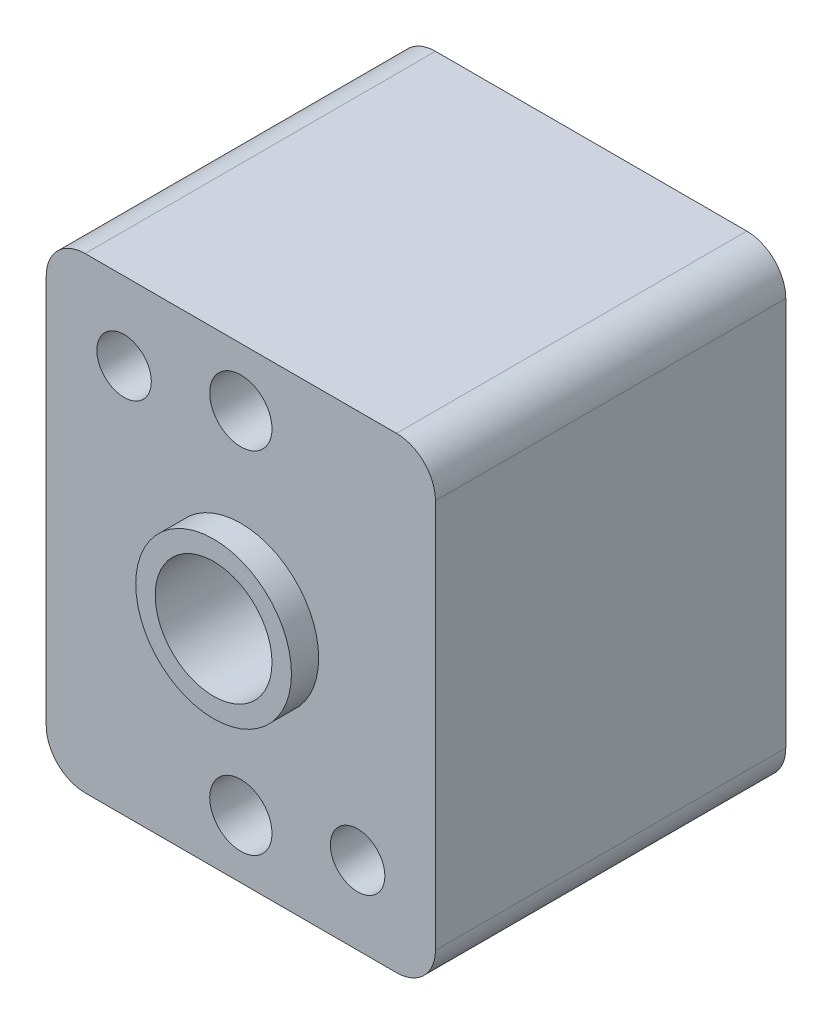
ISO-10303-21;
HEADER;
FILE_DESCRIPTION(('STEP AP214'),'2;1');
FILE_NAME('part.step','',(''),(''),'','','');
FILE_SCHEMA(('AUTOMOTIVE_DESIGN { 1 0 10303 214 1 1 1 1 }'));
ENDSEC;
DATA;
#1=APPLICATION_CONTEXT('core data for automotive mechanical design processes');
#2=APPLICATION_PROTOCOL_DEFINITION('international standard','automotive_design',2000,#1);
#3=PRODUCT_CONTEXT('',#1,'mechanical');
#4=PRODUCT('Part','Part','',(#3));
#5=PRODUCT_RELATED_PRODUCT_CATEGORY('part','',(#4));
#6=PRODUCT_DEFINITION_FORMATION('','',#4);
#7=PRODUCT_DEFINITION_CONTEXT('part definition',#1,'design');
#8=PRODUCT_DEFINITION('design','',#6,#7);
#9=PRODUCT_DEFINITION_SHAPE('','',#8);
#10=(LENGTH_UNIT() NAMED_UNIT(*) SI_UNIT(.MILLI.,.METRE.));
#11=(NAMED_UNIT(*) PLANE_ANGLE_UNIT() SI_UNIT($,.RADIAN.));
#12=(NAMED_UNIT(*) SI_UNIT($,.STERADIAN.) SOLID_ANGLE_UNIT());
#13=UNCERTAINTY_MEASURE_WITH_UNIT(LENGTH_MEASURE(1.E-05),#10,'distance_accuracy_value','');
#14=(GEOMETRIC_REPRESENTATION_CONTEXT(3) GLOBAL_UNCERTAINTY_ASSIGNED_CONTEXT((#13)) GLOBAL_UNIT_ASSIGNED_CONTEXT((#10,
#11,#12)) REPRESENTATION_CONTEXT('',''));
#15=CARTESIAN_POINT('',(0.,0.,0.));
#16=DIRECTION('',(0.,0.,1.));
#17=DIRECTION('',(1.,0.,0.));
#18=AXIS2_PLACEMENT_3D('',#15,#16,#17);
#19=CARTESIAN_POINT('',(0.,0.,9.));
#20=DIRECTION('',(0.,0.,-1.));
#21=DIRECTION('',(-1.,0.,0.));
#22=AXIS2_PLACEMENT_3D('',#19,#20,#21);
#23=PLANE('',#22);
#24=CARTESIAN_POINT('',(2.99999999999998,-4.,9.));
#25=DIRECTION('',(0.,0.,1.));
#26=DIRECTION('',(1.,0.,0.));
#27=AXIS2_PLACEMENT_3D('',#24,#25,#26);
#28=CIRCLE('',#27,0.7);
#29=CARTESIAN_POINT('',(3.69999999999999,-4.,9.));
#30=VERTEX_POINT('',#29);
#31=EDGE_CURVE('E223',#30,#30,#28,.T.);
#32=ORIENTED_EDGE('',*,*,#31,.F.);
#33=EDGE_LOOP('',(#32));
#34=FACE_BOUND('',#33,.T.);
#35=CARTESIAN_POINT('',(-3.,4.,9.));
#36=DIRECTION('',(0.,0.,1.));
#37=DIRECTION('',(1.,0.,0.));
#38=AXIS2_PLACEMENT_3D('',#35,#36,#37);
#39=CIRCLE('',#38,0.7);
#40=CARTESIAN_POINT('',(-2.3,4.,9.));
#41=VERTEX_POINT('',#40);
#42=EDGE_CURVE('E215',#41,#41,#39,.T.);
#43=ORIENTED_EDGE('',*,*,#42,.F.);
#44=EDGE_LOOP('',(#43));
#45=FACE_BOUND('',#44,.T.);
#46=CARTESIAN_POINT('',(0.,-4.5,9.));
#47=DIRECTION('',(0.,0.,1.));
#48=DIRECTION('',(-1.,0.,0.));
#49=AXIS2_PLACEMENT_3D('',#46,#47,#48);
#50=CIRCLE('',#49,0.8);
#51=CARTESIAN_POINT('',(-0.8,-4.5,9.));
#52=VERTEX_POINT('',#51);
#53=EDGE_CURVE('E207',#52,#52,#50,.T.);
#54=ORIENTED_EDGE('',*,*,#53,.F.);
#55=EDGE_LOOP('',(#54));
#56=FACE_BOUND('',#55,.T.);
#57=CARTESIAN_POINT('',(0.,4.5,9.));
#58=DIRECTION('',(0.,0.,1.));
#59=DIRECTION('',(1.,0.,0.));
#60=AXIS2_PLACEMENT_3D('',#57,#58,#59);
#61=CIRCLE('',#60,0.8);
#62=CARTESIAN_POINT('',(0.799999999999999,4.5,9.));
#63=VERTEX_POINT('',#62);
#64=EDGE_CURVE('E202',#63,#63,#61,.T.);
#65=ORIENTED_EDGE('',*,*,#64,.F.);
#66=EDGE_LOOP('',(#65));
#67=FACE_BOUND('',#66,.T.);
#68=DIRECTION('',(0.,1.,0.));
#69=VECTOR('',#68,1.);
#70=CARTESIAN_POINT('',(4.99999999999999,-6.,9.));
#71=LINE('',#70,#69);
#72=CARTESIAN_POINT('',(4.99999999999999,-5.,9.));
#73=VERTEX_POINT('',#72);
#74=CARTESIAN_POINT('',(4.99999999999999,5.,9.));
#75=VERTEX_POINT('',#74);
#76=EDGE_CURVE('E150',#73,#75,#71,.T.);
#77=ORIENTED_EDGE('',*,*,#76,.T.);
#78=CARTESIAN_POINT('',(3.99999999999999,5.,9.));
#79=DIRECTION('',(0.,0.,-1.));
#80=DIRECTION('',(-1.,0.,0.));
#81=AXIS2_PLACEMENT_3D('',#78,#79,#80);
#82=CIRCLE('',#81,1.);
#83=CARTESIAN_POINT('',(3.99999999999999,6.,9.));
#84=VERTEX_POINT('',#83);
#85=EDGE_CURVE('E178',#75,#84,#82,.F.);
#86=ORIENTED_EDGE('',*,*,#85,.T.);
#87=DIRECTION('',(-1.,0.,0.));
#88=VECTOR('',#87,1.);
#89=CARTESIAN_POINT('',(-5.00000000000001,6.,9.));
#90=LINE('',#89,#88);
#91=CARTESIAN_POINT('',(-4.00000000000001,6.,9.));
#92=VERTEX_POINT('',#91);
#93=EDGE_CURVE('E127',#84,#92,#90,.T.);
#94=ORIENTED_EDGE('',*,*,#93,.T.);
#95=CARTESIAN_POINT('',(-4.00000000000001,5.,9.));
#96=DIRECTION('',(0.,0.,-1.));
#97=DIRECTION('',(-1.,0.,0.));
#98=AXIS2_PLACEMENT_3D('',#95,#96,#97);
#99=CIRCLE('',#98,1.);
#100=CARTESIAN_POINT('',(-5.00000000000001,5.,9.));
#101=VERTEX_POINT('',#100);
#102=EDGE_CURVE('E175',#92,#101,#99,.F.);
#103=ORIENTED_EDGE('',*,*,#102,.T.);
#104=DIRECTION('',(0.,-1.,0.));
#105=VECTOR('',#104,1.);
#106=CARTESIAN_POINT('',(-5.00000000000001,-6.,9.));
#107=LINE('',#106,#105);
#108=CARTESIAN_POINT('',(-5.00000000000001,-5.,9.));
#109=VERTEX_POINT('',#108);
#110=EDGE_CURVE('E190',#101,#109,#107,.T.);
#111=ORIENTED_EDGE('',*,*,#110,.T.);
#112=CARTESIAN_POINT('',(-4.00000000000001,-5.,9.));
#113=DIRECTION('',(0.,0.,-1.));
#114=DIRECTION('',(-1.,0.,0.));
#115=AXIS2_PLACEMENT_3D('',#112,#113,#114);
#116=CIRCLE('',#115,1.);
#117=CARTESIAN_POINT('',(-4.00000000000001,-6.,9.));
#118=VERTEX_POINT('',#117);
#119=EDGE_CURVE('E61',#109,#118,#116,.F.);
#120=ORIENTED_EDGE('',*,*,#119,.T.);
#121=DIRECTION('',(1.,0.,0.));
#122=VECTOR('',#121,1.);
#123=CARTESIAN_POINT('',(-5.00000000000001,-6.,9.));
#124=LINE('',#123,#122);
#125=CARTESIAN_POINT('',(3.99999999999999,-6.,9.));
#126=VERTEX_POINT('',#125);
#127=EDGE_CURVE('E155',#118,#126,#124,.T.);
#128=ORIENTED_EDGE('',*,*,#127,.T.);
#129=CARTESIAN_POINT('',(3.99999999999999,-5.,9.));
#130=DIRECTION('',(0.,0.,-1.));
#131=DIRECTION('',(-1.,0.,0.));
#132=AXIS2_PLACEMENT_3D('',#129,#130,#131);
#133=CIRCLE('',#132,1.);
#134=EDGE_CURVE('E170',#126,#73,#133,.F.);
#135=ORIENTED_EDGE('',*,*,#134,.T.);
#136=EDGE_LOOP('',(#77,#86,#94,#103,#111,#120,#128,#135));
#137=FACE_BOUND('',#136,.T.);
#138=CARTESIAN_POINT('',(0.,0.,9.));
#139=DIRECTION('',(0.,0.,-1.));
#140=DIRECTION('',(-1.,0.,0.));
#141=AXIS2_PLACEMENT_3D('',#138,#139,#140);
#142=CIRCLE('',#141,2.);
#143=CARTESIAN_POINT('',(-2.,0.,9.));
#144=VERTEX_POINT('',#143);
#145=EDGE_CURVE('E151',#144,#144,#142,.F.);
#146=ORIENTED_EDGE('',*,*,#145,.F.);
#147=EDGE_LOOP('',(#146));
#148=FACE_BOUND('',#147,.T.);
#149=ADVANCED_FACE('F39',(#34,#45,#56,#67,#137,#148),#23,.F.);
#150=CARTESIAN_POINT('',(0.,0.,0.));
#151=DIRECTION('',(0.,0.,-1.));
#152=DIRECTION('',(-1.,0.,0.));
#153=AXIS2_PLACEMENT_3D('',#150,#151,#152);
#154=PLANE('',#153);
#155=CARTESIAN_POINT('',(-3.,4.,0.));
#156=DIRECTION('',(0.,0.,1.));
#157=DIRECTION('',(1.,0.,0.));
#158=AXIS2_PLACEMENT_3D('',#155,#156,#157);
#159=CIRCLE('',#158,0.7);
#160=CARTESIAN_POINT('',(-2.3,4.,0.));
#161=VERTEX_POINT('',#160);
#162=EDGE_CURVE('E219',#161,#161,#159,.T.);
#163=ORIENTED_EDGE('',*,*,#162,.T.);
#164=EDGE_LOOP('',(#163));
#165=FACE_BOUND('',#164,.T.);
#166=CARTESIAN_POINT('',(0.,4.5,0.));
#167=DIRECTION('',(0.,0.,1.));
#168=DIRECTION('',(1.,0.,0.));
#169=AXIS2_PLACEMENT_3D('',#166,#167,#168);
#170=CIRCLE('',#169,0.8);
#171=CARTESIAN_POINT('',(0.799999999999999,4.5,0.));
#172=VERTEX_POINT('',#171);
#173=EDGE_CURVE('E203',#172,#172,#170,.T.);
#174=ORIENTED_EDGE('',*,*,#173,.T.);
#175=EDGE_LOOP('',(#174));
#176=FACE_BOUND('',#175,.T.);
#177=DIRECTION('',(-1.,0.,0.));
#178=VECTOR('',#177,1.);
#179=CARTESIAN_POINT('',(-5.00000000000001,6.,0.));
#180=LINE('',#179,#178);
#181=CARTESIAN_POINT('',(3.99999999999999,6.,0.));
#182=VERTEX_POINT('',#181);
#183=CARTESIAN_POINT('',(-4.00000000000001,6.,0.));
#184=VERTEX_POINT('',#183);
#185=EDGE_CURVE('E124',#182,#184,#180,.T.);
#186=ORIENTED_EDGE('',*,*,#185,.F.);
#187=CARTESIAN_POINT('',(3.99999999999999,5.,0.));
#188=DIRECTION('',(0.,0.,-1.));
#189=DIRECTION('',(-1.,0.,0.));
#190=AXIS2_PLACEMENT_3D('',#187,#188,#189);
#191=CIRCLE('',#190,1.);
#192=CARTESIAN_POINT('',(4.99999999999999,5.,0.));
#193=VERTEX_POINT('',#192);
#194=EDGE_CURVE('E106',#182,#193,#191,.T.);
#195=ORIENTED_EDGE('',*,*,#194,.T.);
#196=DIRECTION('',(0.,1.,0.));
#197=VECTOR('',#196,1.);
#198=CARTESIAN_POINT('',(4.99999999999999,-6.,0.));
#199=LINE('',#198,#197);
#200=CARTESIAN_POINT('',(4.99999999999999,-5.,0.));
#201=VERTEX_POINT('',#200);
#202=EDGE_CURVE('E137',#201,#193,#199,.T.);
#203=ORIENTED_EDGE('',*,*,#202,.F.);
#204=CARTESIAN_POINT('',(3.99999999999999,-5.,0.));
#205=DIRECTION('',(0.,0.,-1.));
#206=DIRECTION('',(-1.,0.,0.));
#207=AXIS2_PLACEMENT_3D('',#204,#205,#206);
#208=CIRCLE('',#207,1.);
#209=CARTESIAN_POINT('',(3.99999999999999,-6.,0.));
#210=VERTEX_POINT('',#209);
#211=EDGE_CURVE('E129',#201,#210,#208,.T.);
#212=ORIENTED_EDGE('',*,*,#211,.T.);
#213=DIRECTION('',(1.,0.,0.));
#214=VECTOR('',#213,1.);
#215=CARTESIAN_POINT('',(-5.00000000000001,-6.,0.));
#216=LINE('',#215,#214);
#217=CARTESIAN_POINT('',(-4.00000000000001,-6.,0.));
#218=VERTEX_POINT('',#217);
#219=EDGE_CURVE('E142',#218,#210,#216,.T.);
#220=ORIENTED_EDGE('',*,*,#219,.F.);
#221=CARTESIAN_POINT('',(-4.00000000000001,-5.,0.));
#222=DIRECTION('',(0.,0.,-1.));
#223=DIRECTION('',(-1.,0.,0.));
#224=AXIS2_PLACEMENT_3D('',#221,#222,#223);
#225=CIRCLE('',#224,1.);
#226=CARTESIAN_POINT('',(-5.00000000000001,-5.,0.));
#227=VERTEX_POINT('',#226);
#228=EDGE_CURVE('E160',#218,#227,#225,.T.);
#229=ORIENTED_EDGE('',*,*,#228,.T.);
#230=DIRECTION('',(0.,-1.,0.));
#231=VECTOR('',#230,1.);
#232=CARTESIAN_POINT('',(-5.00000000000001,-6.,0.));
#233=LINE('',#232,#231);
#234=CARTESIAN_POINT('',(-5.00000000000001,5.,0.));
#235=VERTEX_POINT('',#234);
#236=EDGE_CURVE('E136',#235,#227,#233,.T.);
#237=ORIENTED_EDGE('',*,*,#236,.F.);
#238=CARTESIAN_POINT('',(-4.00000000000001,5.,0.));
#239=DIRECTION('',(0.,0.,-1.));
#240=DIRECTION('',(-1.,0.,0.));
#241=AXIS2_PLACEMENT_3D('',#238,#239,#240);
#242=CIRCLE('',#241,1.);
#243=EDGE_CURVE('E118',#235,#184,#242,.T.);
#244=ORIENTED_EDGE('',*,*,#243,.T.);
#245=EDGE_LOOP('',(#186,#195,#203,#212,#220,#229,#237,#244));
#246=FACE_BOUND('',#245,.T.);
#247=CARTESIAN_POINT('',(0.,0.,0.));
#248=DIRECTION('',(0.,0.,1.));
#249=DIRECTION('',(1.,0.,0.));
#250=AXIS2_PLACEMENT_3D('',#247,#248,#249);
#251=CIRCLE('',#250,1.5);
#252=CARTESIAN_POINT('',(1.49999999999999,0.,0.));
#253=VERTEX_POINT('',#252);
#254=EDGE_CURVE('E144',#253,#253,#251,.T.);
#255=ORIENTED_EDGE('',*,*,#254,.T.);
#256=EDGE_LOOP('',(#255));
#257=FACE_BOUND('',#256,.T.);
#258=CARTESIAN_POINT('',(0.,-4.5,0.));
#259=DIRECTION('',(0.,0.,1.));
#260=DIRECTION('',(-1.,0.,0.));
#261=AXIS2_PLACEMENT_3D('',#258,#259,#260);
#262=CIRCLE('',#261,0.8);
#263=CARTESIAN_POINT('',(-0.8,-4.5,0.));
#264=VERTEX_POINT('',#263);
#265=EDGE_CURVE('E211',#264,#264,#262,.T.);
#266=ORIENTED_EDGE('',*,*,#265,.T.);
#267=EDGE_LOOP('',(#266));
#268=FACE_BOUND('',#267,.T.);
#269=CARTESIAN_POINT('',(2.99999999999998,-4.,0.));
#270=DIRECTION('',(0.,0.,1.));
#271=DIRECTION('',(1.,0.,0.));
#272=AXIS2_PLACEMENT_3D('',#269,#270,#271);
#273=CIRCLE('',#272,0.7);
#274=CARTESIAN_POINT('',(3.69999999999999,-4.,0.));
#275=VERTEX_POINT('',#274);
#276=EDGE_CURVE('E227',#275,#275,#273,.T.);
#277=ORIENTED_EDGE('',*,*,#276,.T.);
#278=EDGE_LOOP('',(#277));
#279=FACE_BOUND('',#278,.T.);
#280=ADVANCED_FACE('F132',(#165,#176,#246,#257,#268,#279),#154,.T.);
#281=CARTESIAN_POINT('',(4.99999999999999,-6.,9.));
#282=DIRECTION('',(-1.,0.,0.));
#283=DIRECTION('',(0.,0.,1.));
#284=AXIS2_PLACEMENT_3D('',#281,#282,#283);
#285=PLANE('',#284);
#286=ORIENTED_EDGE('',*,*,#202,.T.);
#287=DIRECTION('',(0.,0.,-1.));
#288=VECTOR('',#287,1.);
#289=CARTESIAN_POINT('',(4.99999999999999,5.,9.));
#290=LINE('',#289,#288);
#291=EDGE_CURVE('E111',#193,#75,#290,.F.);
#292=ORIENTED_EDGE('',*,*,#291,.T.);
#293=ORIENTED_EDGE('',*,*,#76,.F.);
#294=DIRECTION('',(0.,0.,-1.));
#295=VECTOR('',#294,1.);
#296=CARTESIAN_POINT('',(4.99999999999999,-5.,9.));
#297=LINE('',#296,#295);
#298=EDGE_CURVE('E117',#73,#201,#297,.T.);
#299=ORIENTED_EDGE('',*,*,#298,.T.);
#300=EDGE_LOOP('',(#286,#292,#293,#299));
#301=FACE_BOUND('',#300,.T.);
#302=ADVANCED_FACE('F266',(#301),#285,.F.);
#303=CARTESIAN_POINT('',(-5.00000000000001,6.,9.));
#304=DIRECTION('',(0.,-1.,0.));
#305=DIRECTION('',(0.,0.,-1.));
#306=AXIS2_PLACEMENT_3D('',#303,#304,#305);
#307=PLANE('',#306);
#308=ORIENTED_EDGE('',*,*,#93,.F.);
#309=DIRECTION('',(0.,0.,-1.));
#310=VECTOR('',#309,1.);
#311=CARTESIAN_POINT('',(3.99999999999999,6.,9.));
#312=LINE('',#311,#310);
#313=EDGE_CURVE('E110',#84,#182,#312,.T.);
#314=ORIENTED_EDGE('',*,*,#313,.T.);
#315=ORIENTED_EDGE('',*,*,#185,.T.);
#316=DIRECTION('',(0.,0.,-1.));
#317=VECTOR('',#316,1.);
#318=CARTESIAN_POINT('',(-4.00000000000001,6.,9.));
#319=LINE('',#318,#317);
#320=EDGE_CURVE('E130',#184,#92,#319,.F.);
#321=ORIENTED_EDGE('',*,*,#320,.T.);
#322=EDGE_LOOP('',(#308,#314,#315,#321));
#323=FACE_BOUND('',#322,.T.);
#324=ADVANCED_FACE('F123',(#323),#307,.F.);
#325=CARTESIAN_POINT('',(-5.00000000000001,-6.,9.));
#326=DIRECTION('',(1.,0.,0.));
#327=DIRECTION('',(0.,0.,-1.));
#328=AXIS2_PLACEMENT_3D('',#325,#326,#327);
#329=PLANE('',#328);
#330=ORIENTED_EDGE('',*,*,#110,.F.);
#331=DIRECTION('',(0.,0.,-1.));
#332=VECTOR('',#331,1.);
#333=CARTESIAN_POINT('',(-5.00000000000001,5.,9.));
#334=LINE('',#333,#332);
#335=EDGE_CURVE('E184',#101,#235,#334,.T.);
#336=ORIENTED_EDGE('',*,*,#335,.T.);
#337=ORIENTED_EDGE('',*,*,#236,.T.);
#338=DIRECTION('',(0.,0.,-1.));
#339=VECTOR('',#338,1.);
#340=CARTESIAN_POINT('',(-5.00000000000001,-5.,9.));
#341=LINE('',#340,#339);
#342=EDGE_CURVE('E181',#227,#109,#341,.F.);
#343=ORIENTED_EDGE('',*,*,#342,.T.);
#344=EDGE_LOOP('',(#330,#336,#337,#343));
#345=FACE_BOUND('',#344,.T.);
#346=ADVANCED_FACE('F277',(#345),#329,.F.);
#347=CARTESIAN_POINT('',(-5.00000000000001,-6.,9.));
#348=DIRECTION('',(0.,1.,0.));
#349=DIRECTION('',(0.,0.,1.));
#350=AXIS2_PLACEMENT_3D('',#347,#348,#349);
#351=PLANE('',#350);
#352=ORIENTED_EDGE('',*,*,#127,.F.);
#353=DIRECTION('',(0.,0.,-1.));
#354=VECTOR('',#353,1.);
#355=CARTESIAN_POINT('',(-4.00000000000001,-6.,9.));
#356=LINE('',#355,#354);
#357=EDGE_CURVE('E11',#118,#218,#356,.T.);
#358=ORIENTED_EDGE('',*,*,#357,.T.);
#359=ORIENTED_EDGE('',*,*,#219,.T.);
#360=DIRECTION('',(0.,0.,-1.));
#361=VECTOR('',#360,1.);
#362=CARTESIAN_POINT('',(3.99999999999999,-6.,9.));
#363=LINE('',#362,#361);
#364=EDGE_CURVE('E48',#210,#126,#363,.F.);
#365=ORIENTED_EDGE('',*,*,#364,.T.);
#366=EDGE_LOOP('',(#352,#358,#359,#365));
#367=FACE_BOUND('',#366,.T.);
#368=ADVANCED_FACE('F274',(#367),#351,.F.);
#369=CARTESIAN_POINT('',(0.,0.,9.));
#370=DIRECTION('',(0.,0.,-1.));
#371=DIRECTION('',(-1.,0.,0.));
#372=AXIS2_PLACEMENT_3D('',#369,#370,#371);
#373=CYLINDRICAL_SURFACE('',#372,1.5);
#374=ORIENTED_EDGE('',*,*,#254,.F.);
#375=EDGE_LOOP('',(#374));
#376=FACE_BOUND('',#375,.T.);
#377=CARTESIAN_POINT('',(0.,0.,9.7));
#378=DIRECTION('',(0.,0.,1.));
#379=DIRECTION('',(1.,0.,0.));
#380=AXIS2_PLACEMENT_3D('',#377,#378,#379);
#381=CIRCLE('',#380,1.49999999999999);
#382=CARTESIAN_POINT('',(1.49999999999999,0.,9.7));
#383=VERTEX_POINT('',#382);
#384=EDGE_CURVE('E238',#383,#383,#381,.T.);
#385=ORIENTED_EDGE('',*,*,#384,.T.);
#386=EDGE_LOOP('',(#385));
#387=FACE_BOUND('',#386,.T.);
#388=ADVANCED_FACE('F243',(#376,#387),#373,.F.);
#389=CARTESIAN_POINT('',(0.,4.5,9.));
#390=DIRECTION('',(0.,0.,-1.));
#391=DIRECTION('',(-1.,0.,0.));
#392=AXIS2_PLACEMENT_3D('',#389,#390,#391);
#393=CYLINDRICAL_SURFACE('',#392,0.8);
#394=ORIENTED_EDGE('',*,*,#64,.T.);
#395=EDGE_LOOP('',(#394));
#396=FACE_BOUND('',#395,.T.);
#397=ORIENTED_EDGE('',*,*,#173,.F.);
#398=EDGE_LOOP('',(#397));
#399=FACE_BOUND('',#398,.T.);
#400=ADVANCED_FACE('F382',(#396,#399),#393,.F.);
#401=CARTESIAN_POINT('',(0.,-4.5,9.));
#402=DIRECTION('',(0.,0.,-1.));
#403=DIRECTION('',(-1.,0.,0.));
#404=AXIS2_PLACEMENT_3D('',#401,#402,#403);
#405=CYLINDRICAL_SURFACE('',#404,0.8);
#406=ORIENTED_EDGE('',*,*,#53,.T.);
#407=EDGE_LOOP('',(#406));
#408=FACE_BOUND('',#407,.T.);
#409=ORIENTED_EDGE('',*,*,#265,.F.);
#410=EDGE_LOOP('',(#409));
#411=FACE_BOUND('',#410,.T.);
#412=ADVANCED_FACE('F397',(#408,#411),#405,.F.);
#413=CARTESIAN_POINT('',(-3.,4.,9.));
#414=DIRECTION('',(0.,0.,-1.));
#415=DIRECTION('',(-1.,0.,0.));
#416=AXIS2_PLACEMENT_3D('',#413,#414,#415);
#417=CYLINDRICAL_SURFACE('',#416,0.7);
#418=ORIENTED_EDGE('',*,*,#42,.T.);
#419=EDGE_LOOP('',(#418));
#420=FACE_BOUND('',#419,.T.);
#421=ORIENTED_EDGE('',*,*,#162,.F.);
#422=EDGE_LOOP('',(#421));
#423=FACE_BOUND('',#422,.T.);
#424=ADVANCED_FACE('F257',(#420,#423),#417,.F.);
#425=CARTESIAN_POINT('',(2.99999999999998,-4.,9.));
#426=DIRECTION('',(0.,0.,-1.));
#427=DIRECTION('',(-1.,0.,0.));
#428=AXIS2_PLACEMENT_3D('',#425,#426,#427);
#429=CYLINDRICAL_SURFACE('',#428,0.7);
#430=ORIENTED_EDGE('',*,*,#31,.T.);
#431=EDGE_LOOP('',(#430));
#432=FACE_BOUND('',#431,.T.);
#433=ORIENTED_EDGE('',*,*,#276,.F.);
#434=EDGE_LOOP('',(#433));
#435=FACE_BOUND('',#434,.T.);
#436=ADVANCED_FACE('F248',(#432,#435),#429,.F.);
#437=CARTESIAN_POINT('',(0.,0.,9.7));
#438=DIRECTION('',(0.,0.,1.));
#439=DIRECTION('',(1.,0.,0.));
#440=AXIS2_PLACEMENT_3D('',#437,#438,#439);
#441=PLANE('',#440);
#442=CARTESIAN_POINT('',(0.,0.,9.7));
#443=DIRECTION('',(0.,0.,1.));
#444=DIRECTION('',(1.,0.,0.));
#445=AXIS2_PLACEMENT_3D('',#442,#443,#444);
#446=CIRCLE('',#445,2.);
#447=CARTESIAN_POINT('',(2.,0.,9.7));
#448=VERTEX_POINT('',#447);
#449=EDGE_CURVE('E231',#448,#448,#446,.T.);
#450=ORIENTED_EDGE('',*,*,#449,.T.);
#451=EDGE_LOOP('',(#450));
#452=FACE_BOUND('',#451,.T.);
#453=ORIENTED_EDGE('',*,*,#384,.F.);
#454=EDGE_LOOP('',(#453));
#455=FACE_BOUND('',#454,.T.);
#456=ADVANCED_FACE('F245',(#452,#455),#441,.T.);
#457=CARTESIAN_POINT('',(0.,0.,9.7));
#458=DIRECTION('',(0.,0.,-1.));
#459=DIRECTION('',(-1.,0.,0.));
#460=AXIS2_PLACEMENT_3D('',#457,#458,#459);
#461=CYLINDRICAL_SURFACE('',#460,2.);
#462=ORIENTED_EDGE('',*,*,#449,.F.);
#463=EDGE_LOOP('',(#462));
#464=FACE_BOUND('',#463,.T.);
#465=ORIENTED_EDGE('',*,*,#145,.T.);
#466=EDGE_LOOP('',(#465));
#467=FACE_BOUND('',#466,.T.);
#468=ADVANCED_FACE('F247',(#464,#467),#461,.T.);
#469=CARTESIAN_POINT('',(3.99999999999999,5.,9.));
#470=DIRECTION('',(0.,0.,-1.));
#471=DIRECTION('',(-1.,0.,0.));
#472=AXIS2_PLACEMENT_3D('',#469,#470,#471);
#473=CYLINDRICAL_SURFACE('',#472,1.);
#474=ORIENTED_EDGE('',*,*,#85,.F.);
#475=ORIENTED_EDGE('',*,*,#291,.F.);
#476=ORIENTED_EDGE('',*,*,#194,.F.);
#477=ORIENTED_EDGE('',*,*,#313,.F.);
#478=EDGE_LOOP('',(#474,#475,#476,#477));
#479=FACE_BOUND('',#478,.T.);
#480=ADVANCED_FACE('F109',(#479),#473,.T.);
#481=CARTESIAN_POINT('',(-4.00000000000001,5.,9.));
#482=DIRECTION('',(0.,0.,-1.));
#483=DIRECTION('',(-1.,0.,0.));
#484=AXIS2_PLACEMENT_3D('',#481,#482,#483);
#485=CYLINDRICAL_SURFACE('',#484,1.);
#486=ORIENTED_EDGE('',*,*,#102,.F.);
#487=ORIENTED_EDGE('',*,*,#320,.F.);
#488=ORIENTED_EDGE('',*,*,#243,.F.);
#489=ORIENTED_EDGE('',*,*,#335,.F.);
#490=EDGE_LOOP('',(#486,#487,#488,#489));
#491=FACE_BOUND('',#490,.T.);
#492=ADVANCED_FACE('F288',(#491),#485,.T.);
#493=CARTESIAN_POINT('',(-4.00000000000001,-5.,9.));
#494=DIRECTION('',(0.,0.,-1.));
#495=DIRECTION('',(-1.,0.,0.));
#496=AXIS2_PLACEMENT_3D('',#493,#494,#495);
#497=CYLINDRICAL_SURFACE('',#496,1.);
#498=ORIENTED_EDGE('',*,*,#119,.F.);
#499=ORIENTED_EDGE('',*,*,#342,.F.);
#500=ORIENTED_EDGE('',*,*,#228,.F.);
#501=ORIENTED_EDGE('',*,*,#357,.F.);
#502=EDGE_LOOP('',(#498,#499,#500,#501));
#503=FACE_BOUND('',#502,.T.);
#504=ADVANCED_FACE('F290',(#503),#497,.T.);
#505=CARTESIAN_POINT('',(3.99999999999999,-5.,9.));
#506=DIRECTION('',(0.,0.,-1.));
#507=DIRECTION('',(-1.,0.,0.));
#508=AXIS2_PLACEMENT_3D('',#505,#506,#507);
#509=CYLINDRICAL_SURFACE('',#508,1.);
#510=ORIENTED_EDGE('',*,*,#134,.F.);
#511=ORIENTED_EDGE('',*,*,#364,.F.);
#512=ORIENTED_EDGE('',*,*,#211,.F.);
#513=ORIENTED_EDGE('',*,*,#298,.F.);
#514=EDGE_LOOP('',(#510,#511,#512,#513));
#515=FACE_BOUND('',#514,.T.);
#516=ADVANCED_FACE('F41',(#515),#509,.T.);
#517=CLOSED_SHELL('',(#149,#280,#302,#324,#346,#368,#388,#400,#412,#424,#436,#456,#468,#480,
#492,#504,#516));
#518=MANIFOLD_SOLID_BREP('B2',#517);
#519=ADVANCED_BREP_SHAPE_REPRESENTATION('',(#18,#518),#14);
#520=SHAPE_DEFINITION_REPRESENTATION(#9,#519);
ENDSEC;
END-ISO-10303-21;
